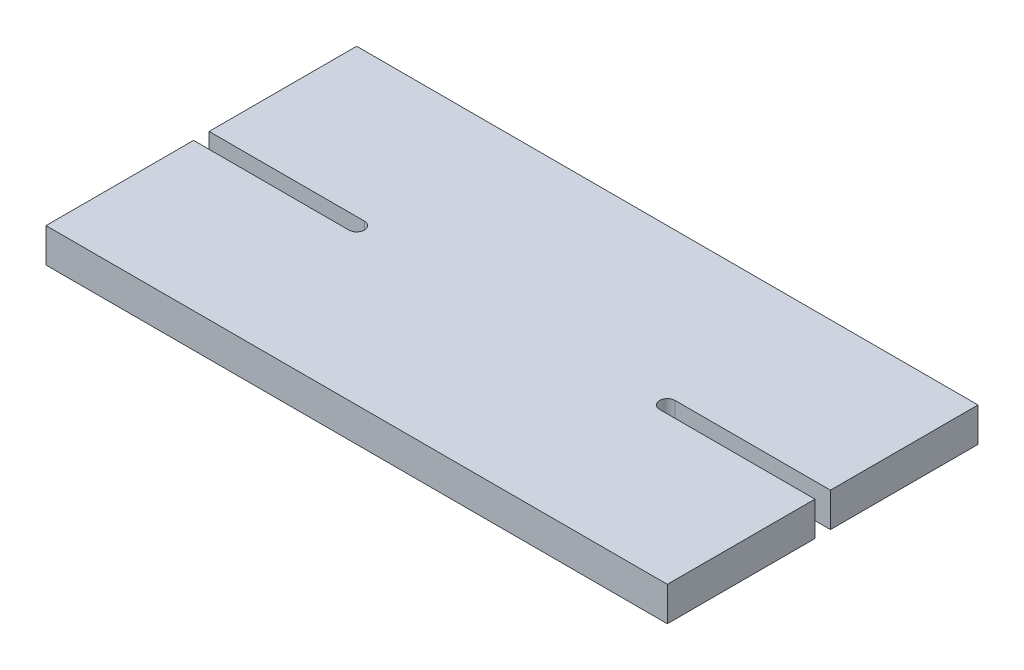
ISO-10303-21;
HEADER;
FILE_DESCRIPTION(('STEP AP214'),'2;1');
FILE_NAME('part.step','',(''),(''),'','','');
FILE_SCHEMA(('AUTOMOTIVE_DESIGN { 1 0 10303 214 1 1 1 1 }'));
ENDSEC;
DATA;
#1=APPLICATION_CONTEXT('core data for automotive mechanical design processes');
#2=APPLICATION_PROTOCOL_DEFINITION('international standard','automotive_design',2000,#1);
#3=PRODUCT_CONTEXT('',#1,'mechanical');
#4=PRODUCT('Part','Part','',(#3));
#5=PRODUCT_RELATED_PRODUCT_CATEGORY('part','',(#4));
#6=PRODUCT_DEFINITION_FORMATION('','',#4);
#7=PRODUCT_DEFINITION_CONTEXT('part definition',#1,'design');
#8=PRODUCT_DEFINITION('design','',#6,#7);
#9=PRODUCT_DEFINITION_SHAPE('','',#8);
#10=(LENGTH_UNIT() NAMED_UNIT(*) SI_UNIT(.MILLI.,.METRE.));
#11=(NAMED_UNIT(*) PLANE_ANGLE_UNIT() SI_UNIT($,.RADIAN.));
#12=(NAMED_UNIT(*) SI_UNIT($,.STERADIAN.) SOLID_ANGLE_UNIT());
#13=UNCERTAINTY_MEASURE_WITH_UNIT(LENGTH_MEASURE(1.E-05),#10,'distance_accuracy_value','');
#14=(GEOMETRIC_REPRESENTATION_CONTEXT(3) GLOBAL_UNCERTAINTY_ASSIGNED_CONTEXT((#13)) GLOBAL_UNIT_ASSIGNED_CONTEXT((#10,
#11,#12)) REPRESENTATION_CONTEXT('',''));
#15=CARTESIAN_POINT('',(0.,0.,0.));
#16=DIRECTION('',(0.,0.,1.));
#17=DIRECTION('',(1.,0.,0.));
#18=AXIS2_PLACEMENT_3D('',#15,#16,#17);
#19=CARTESIAN_POINT('',(200.01,1000.01,-5.));
#20=DIRECTION('',(0.,0.,1.));
#21=DIRECTION('',(-1.,0.,0.));
#22=AXIS2_PLACEMENT_3D('',#19,#20,#21);
#23=PLANE('',#22);
#24=DIRECTION('',(-1.,0.,0.));
#25=VECTOR('',#24,1.);
#26=CARTESIAN_POINT('',(0.,978.,-5.));
#27=LINE('',#26,#25);
#28=CARTESIAN_POINT('',(200.,978.,-5.));
#29=VERTEX_POINT('',#28);
#30=CARTESIAN_POINT('',(100.,978.,-5.00000000000001));
#31=VERTEX_POINT('',#30);
#32=EDGE_CURVE('E188',#29,#31,#27,.T.);
#33=ORIENTED_EDGE('',*,*,#32,.F.);
#34=DIRECTION('',(0.,-1.,0.));
#35=VECTOR('',#34,1.);
#36=CARTESIAN_POINT('',(200.,989.,-5.));
#37=LINE('',#36,#35);
#38=CARTESIAN_POINT('',(200.,1000.,-5.));
#39=VERTEX_POINT('',#38);
#40=EDGE_CURVE('E189',#39,#29,#37,.T.);
#41=ORIENTED_EDGE('',*,*,#40,.F.);
#42=DIRECTION('',(1.,0.,0.));
#43=VECTOR('',#42,1.);
#44=CARTESIAN_POINT('',(0.,1000.,-5.));
#45=LINE('',#44,#43);
#46=CARTESIAN_POINT('',(100.,1000.,-5.00000000000001));
#47=VERTEX_POINT('',#46);
#48=EDGE_CURVE('E207',#47,#39,#45,.T.);
#49=ORIENTED_EDGE('',*,*,#48,.F.);
#50=DIRECTION('',(0.,1.,0.));
#51=VECTOR('',#50,1.);
#52=CARTESIAN_POINT('',(100.,989.,-5.00000000000001));
#53=LINE('',#52,#51);
#54=EDGE_CURVE('E183',#31,#47,#53,.T.);
#55=ORIENTED_EDGE('',*,*,#54,.F.);
#56=EDGE_LOOP('',(#33,#41,#49,#55));
#57=FACE_BOUND('',#56,.T.);
#58=ADVANCED_FACE('F17',(#57),#23,.T.);
#59=CARTESIAN_POINT('',(100.,1000.,0.));
#60=DIRECTION('',(0.,-1.,0.));
#61=DIRECTION('',(0.,0.,-1.));
#62=AXIS2_PLACEMENT_3D('',#59,#60,#61);
#63=CYLINDRICAL_SURFACE('',#62,4.99999999999999);
#64=CARTESIAN_POINT('',(100.,978.,0.));
#65=DIRECTION('',(0.,-1.,0.));
#66=DIRECTION('',(0.,0.,-1.));
#67=AXIS2_PLACEMENT_3D('',#64,#65,#66);
#68=CIRCLE('',#67,4.99999999999999);
#69=CARTESIAN_POINT('',(100.,978.,4.99999999999999));
#70=VERTEX_POINT('',#69);
#71=EDGE_CURVE('E234',#31,#70,#68,.F.);
#72=ORIENTED_EDGE('',*,*,#71,.F.);
#73=ORIENTED_EDGE('',*,*,#54,.T.);
#74=CARTESIAN_POINT('',(100.,1000.,0.));
#75=DIRECTION('',(0.,-1.,0.));
#76=DIRECTION('',(0.,0.,-1.));
#77=AXIS2_PLACEMENT_3D('',#74,#75,#76);
#78=CIRCLE('',#77,4.99999999999999);
#79=CARTESIAN_POINT('',(100.,1000.,5.00000000000001));
#80=VERTEX_POINT('',#79);
#81=EDGE_CURVE('E236',#80,#47,#78,.T.);
#82=ORIENTED_EDGE('',*,*,#81,.F.);
#83=DIRECTION('',(0.,1.,0.));
#84=VECTOR('',#83,1.);
#85=CARTESIAN_POINT('',(100.,989.,4.99999999999999));
#86=LINE('',#85,#84);
#87=EDGE_CURVE('E179',#70,#80,#86,.T.);
#88=ORIENTED_EDGE('',*,*,#87,.F.);
#89=EDGE_LOOP('',(#72,#73,#82,#88));
#90=FACE_BOUND('',#89,.T.);
#91=ADVANCED_FACE('F275',(#90),#63,.F.);
#92=CARTESIAN_POINT('',(99.99,1000.01,4.99999999999999));
#93=DIRECTION('',(0.,0.,-1.));
#94=DIRECTION('',(1.,0.,0.));
#95=AXIS2_PLACEMENT_3D('',#92,#93,#94);
#96=PLANE('',#95);
#97=DIRECTION('',(1.,0.,0.));
#98=VECTOR('',#97,1.);
#99=CARTESIAN_POINT('',(0.,978.,4.99999999999999));
#100=LINE('',#99,#98);
#101=CARTESIAN_POINT('',(200.,978.,4.99999999999999));
#102=VERTEX_POINT('',#101);
#103=EDGE_CURVE('E175',#70,#102,#100,.T.);
#104=ORIENTED_EDGE('',*,*,#103,.F.);
#105=ORIENTED_EDGE('',*,*,#87,.T.);
#106=DIRECTION('',(-1.,0.,0.));
#107=VECTOR('',#106,1.);
#108=CARTESIAN_POINT('',(0.,1000.,5.00000000000002));
#109=LINE('',#108,#107);
#110=CARTESIAN_POINT('',(200.,1000.,5.00000000000001));
#111=VERTEX_POINT('',#110);
#112=EDGE_CURVE('E217',#111,#80,#109,.T.);
#113=ORIENTED_EDGE('',*,*,#112,.F.);
#114=DIRECTION('',(0.,1.,0.));
#115=VECTOR('',#114,1.);
#116=CARTESIAN_POINT('',(200.,989.,5.));
#117=LINE('',#116,#115);
#118=EDGE_CURVE('E170',#102,#111,#117,.T.);
#119=ORIENTED_EDGE('',*,*,#118,.F.);
#120=EDGE_LOOP('',(#104,#105,#113,#119));
#121=FACE_BOUND('',#120,.T.);
#122=ADVANCED_FACE('F279',(#121),#96,.T.);
#123=CARTESIAN_POINT('',(200.,1000.01,4.99));
#124=DIRECTION('',(1.,0.,0.));
#125=DIRECTION('',(0.,0.,1.));
#126=AXIS2_PLACEMENT_3D('',#123,#124,#125);
#127=PLANE('',#126);
#128=DIRECTION('',(0.,0.,1.));
#129=VECTOR('',#128,1.);
#130=CARTESIAN_POINT('',(200.,978.,0.));
#131=LINE('',#130,#129);
#132=CARTESIAN_POINT('',(200.,978.,100.));
#133=VERTEX_POINT('',#132);
#134=EDGE_CURVE('E166',#102,#133,#131,.T.);
#135=ORIENTED_EDGE('',*,*,#134,.F.);
#136=ORIENTED_EDGE('',*,*,#118,.T.);
#137=DIRECTION('',(0.,0.,-1.));
#138=VECTOR('',#137,1.);
#139=CARTESIAN_POINT('',(200.,1000.,0.));
#140=LINE('',#139,#138);
#141=CARTESIAN_POINT('',(200.,1000.,100.));
#142=VERTEX_POINT('',#141);
#143=EDGE_CURVE('E214',#142,#111,#140,.T.);
#144=ORIENTED_EDGE('',*,*,#143,.F.);
#145=DIRECTION('',(0.,1.,0.));
#146=VECTOR('',#145,1.);
#147=CARTESIAN_POINT('',(200.,989.,100.));
#148=LINE('',#147,#146);
#149=EDGE_CURVE('E161',#133,#142,#148,.T.);
#150=ORIENTED_EDGE('',*,*,#149,.F.);
#151=EDGE_LOOP('',(#135,#136,#144,#150));
#152=FACE_BOUND('',#151,.T.);
#153=ADVANCED_FACE('F282',(#152),#127,.T.);
#154=CARTESIAN_POINT('',(200.01,1000.01,100.));
#155=DIRECTION('',(0.,0.,1.));
#156=DIRECTION('',(-1.,0.,0.));
#157=AXIS2_PLACEMENT_3D('',#154,#155,#156);
#158=PLANE('',#157);
#159=DIRECTION('',(-1.,0.,0.));
#160=VECTOR('',#159,1.);
#161=CARTESIAN_POINT('',(0.,978.,100.));
#162=LINE('',#161,#160);
#163=CARTESIAN_POINT('',(-200.,978.,100.));
#164=VERTEX_POINT('',#163);
#165=EDGE_CURVE('E157',#133,#164,#162,.T.);
#166=ORIENTED_EDGE('',*,*,#165,.F.);
#167=ORIENTED_EDGE('',*,*,#149,.T.);
#168=DIRECTION('',(1.,0.,0.));
#169=VECTOR('',#168,1.);
#170=CARTESIAN_POINT('',(0.,1000.,100.));
#171=LINE('',#170,#169);
#172=CARTESIAN_POINT('',(-200.,1000.,100.));
#173=VERTEX_POINT('',#172);
#174=EDGE_CURVE('E218',#173,#142,#171,.T.);
#175=ORIENTED_EDGE('',*,*,#174,.F.);
#176=DIRECTION('',(0.,1.,0.));
#177=VECTOR('',#176,1.);
#178=CARTESIAN_POINT('',(-200.,989.,100.));
#179=LINE('',#178,#177);
#180=EDGE_CURVE('E150',#164,#173,#179,.T.);
#181=ORIENTED_EDGE('',*,*,#180,.F.);
#182=EDGE_LOOP('',(#166,#167,#175,#181));
#183=FACE_BOUND('',#182,.T.);
#184=ADVANCED_FACE('F286',(#183),#158,.T.);
#185=CARTESIAN_POINT('',(-200.,1000.01,100.01));
#186=DIRECTION('',(-1.,0.,0.));
#187=DIRECTION('',(0.,0.,-1.));
#188=AXIS2_PLACEMENT_3D('',#185,#186,#187);
#189=PLANE('',#188);
#190=DIRECTION('',(0.,0.,-1.));
#191=VECTOR('',#190,1.);
#192=CARTESIAN_POINT('',(-200.,978.,0.));
#193=LINE('',#192,#191);
#194=CARTESIAN_POINT('',(-200.,978.,5.00000000000001));
#195=VERTEX_POINT('',#194);
#196=EDGE_CURVE('E153',#164,#195,#193,.T.);
#197=ORIENTED_EDGE('',*,*,#196,.F.);
#198=ORIENTED_EDGE('',*,*,#180,.T.);
#199=DIRECTION('',(0.,0.,1.));
#200=VECTOR('',#199,1.);
#201=CARTESIAN_POINT('',(-200.,1000.,0.));
#202=LINE('',#201,#200);
#203=CARTESIAN_POINT('',(-200.,1000.,5.00000000000001));
#204=VERTEX_POINT('',#203);
#205=EDGE_CURVE('E126',#204,#173,#202,.T.);
#206=ORIENTED_EDGE('',*,*,#205,.F.);
#207=DIRECTION('',(0.,1.,0.));
#208=VECTOR('',#207,1.);
#209=CARTESIAN_POINT('',(-200.,989.,4.99999999999999));
#210=LINE('',#209,#208);
#211=EDGE_CURVE('E118',#195,#204,#210,.T.);
#212=ORIENTED_EDGE('',*,*,#211,.F.);
#213=EDGE_LOOP('',(#197,#198,#206,#212));
#214=FACE_BOUND('',#213,.T.);
#215=ADVANCED_FACE('F289',(#214),#189,.T.);
#216=CARTESIAN_POINT('',(-200.01,1000.01,4.99999999999999));
#217=DIRECTION('',(0.,0.,-1.));
#218=DIRECTION('',(1.,0.,0.));
#219=AXIS2_PLACEMENT_3D('',#216,#217,#218);
#220=PLANE('',#219);
#221=DIRECTION('',(1.,0.,0.));
#222=VECTOR('',#221,1.);
#223=CARTESIAN_POINT('',(0.,978.,5.00000000000002));
#224=LINE('',#223,#222);
#225=CARTESIAN_POINT('',(-100.,978.,5.00000000000002));
#226=VERTEX_POINT('',#225);
#227=EDGE_CURVE('E156',#195,#226,#224,.T.);
#228=ORIENTED_EDGE('',*,*,#227,.F.);
#229=ORIENTED_EDGE('',*,*,#211,.T.);
#230=DIRECTION('',(-1.,0.,0.));
#231=VECTOR('',#230,1.);
#232=CARTESIAN_POINT('',(0.,1000.,5.00000000000002));
#233=LINE('',#232,#231);
#234=CARTESIAN_POINT('',(-100.,1000.,5.00000000000002));
#235=VERTEX_POINT('',#234);
#236=EDGE_CURVE('E121',#235,#204,#233,.T.);
#237=ORIENTED_EDGE('',*,*,#236,.F.);
#238=DIRECTION('',(0.,1.,0.));
#239=VECTOR('',#238,1.);
#240=CARTESIAN_POINT('',(-100.,989.,5.00000000000001));
#241=LINE('',#240,#239);
#242=EDGE_CURVE('E108',#226,#235,#241,.T.);
#243=ORIENTED_EDGE('',*,*,#242,.F.);
#244=EDGE_LOOP('',(#228,#229,#237,#243));
#245=FACE_BOUND('',#244,.T.);
#246=ADVANCED_FACE('F122',(#245),#220,.T.);
#247=CARTESIAN_POINT('',(-100.,1000.,0.));
#248=DIRECTION('',(0.,-1.,0.));
#249=DIRECTION('',(0.,0.,-1.));
#250=AXIS2_PLACEMENT_3D('',#247,#248,#249);
#251=CYLINDRICAL_SURFACE('',#250,5.);
#252=CARTESIAN_POINT('',(-100.,978.,0.));
#253=DIRECTION('',(0.,-1.,0.));
#254=DIRECTION('',(0.,0.,-1.));
#255=AXIS2_PLACEMENT_3D('',#252,#253,#254);
#256=CIRCLE('',#255,5.);
#257=CARTESIAN_POINT('',(-100.,978.,-5.));
#258=VERTEX_POINT('',#257);
#259=EDGE_CURVE('E114',#226,#258,#256,.F.);
#260=ORIENTED_EDGE('',*,*,#259,.F.);
#261=ORIENTED_EDGE('',*,*,#242,.T.);
#262=CARTESIAN_POINT('',(-100.,1000.,0.));
#263=DIRECTION('',(0.,-1.,0.));
#264=DIRECTION('',(0.,0.,-1.));
#265=AXIS2_PLACEMENT_3D('',#262,#263,#264);
#266=CIRCLE('',#265,5.);
#267=CARTESIAN_POINT('',(-100.,1000.,-5.));
#268=VERTEX_POINT('',#267);
#269=EDGE_CURVE('E21',#268,#235,#266,.T.);
#270=ORIENTED_EDGE('',*,*,#269,.F.);
#271=DIRECTION('',(0.,1.,0.));
#272=VECTOR('',#271,1.);
#273=CARTESIAN_POINT('',(-100.,989.,-5.));
#274=LINE('',#273,#272);
#275=EDGE_CURVE('E103',#258,#268,#274,.T.);
#276=ORIENTED_EDGE('',*,*,#275,.F.);
#277=EDGE_LOOP('',(#260,#261,#270,#276));
#278=FACE_BOUND('',#277,.T.);
#279=ADVANCED_FACE('F110',(#278),#251,.F.);
#280=CARTESIAN_POINT('',(-99.99,1000.01,-5.));
#281=DIRECTION('',(0.,0.,1.));
#282=DIRECTION('',(-1.,0.,0.));
#283=AXIS2_PLACEMENT_3D('',#280,#281,#282);
#284=PLANE('',#283);
#285=DIRECTION('',(-1.,0.,0.));
#286=VECTOR('',#285,1.);
#287=CARTESIAN_POINT('',(0.,978.,-5.));
#288=LINE('',#287,#286);
#289=CARTESIAN_POINT('',(-200.,978.,-5.));
#290=VERTEX_POINT('',#289);
#291=EDGE_CURVE('E230',#258,#290,#288,.T.);
#292=ORIENTED_EDGE('',*,*,#291,.F.);
#293=ORIENTED_EDGE('',*,*,#275,.T.);
#294=DIRECTION('',(1.,0.,0.));
#295=VECTOR('',#294,1.);
#296=CARTESIAN_POINT('',(0.,1000.,-5.));
#297=LINE('',#296,#295);
#298=CARTESIAN_POINT('',(-200.,1000.,-5.));
#299=VERTEX_POINT('',#298);
#300=EDGE_CURVE('E131',#299,#268,#297,.T.);
#301=ORIENTED_EDGE('',*,*,#300,.F.);
#302=DIRECTION('',(0.,1.,0.));
#303=VECTOR('',#302,1.);
#304=CARTESIAN_POINT('',(-200.,989.,-5.));
#305=LINE('',#304,#303);
#306=EDGE_CURVE('E139',#290,#299,#305,.T.);
#307=ORIENTED_EDGE('',*,*,#306,.F.);
#308=EDGE_LOOP('',(#292,#293,#301,#307));
#309=FACE_BOUND('',#308,.T.);
#310=ADVANCED_FACE('F262',(#309),#284,.T.);
#311=CARTESIAN_POINT('',(-200.01,1000.,100.01));
#312=DIRECTION('',(0.,1.,0.));
#313=DIRECTION('',(1.,0.,0.));
#314=AXIS2_PLACEMENT_3D('',#311,#312,#313);
#315=PLANE('',#314);
#316=ORIENTED_EDGE('',*,*,#81,.T.);
#317=ORIENTED_EDGE('',*,*,#48,.T.);
#318=DIRECTION('',(0.,0.,1.));
#319=VECTOR('',#318,1.);
#320=CARTESIAN_POINT('',(200.,1000.,-52.5));
#321=LINE('',#320,#319);
#322=CARTESIAN_POINT('',(200.,1000.,-100.));
#323=VERTEX_POINT('',#322);
#324=EDGE_CURVE('E193',#323,#39,#321,.T.);
#325=ORIENTED_EDGE('',*,*,#324,.F.);
#326=DIRECTION('',(1.,0.,0.));
#327=VECTOR('',#326,1.);
#328=CARTESIAN_POINT('',(0.,1000.,-100.));
#329=LINE('',#328,#327);
#330=CARTESIAN_POINT('',(-200.,1000.,-100.));
#331=VERTEX_POINT('',#330);
#332=EDGE_CURVE('E142',#331,#323,#329,.T.);
#333=ORIENTED_EDGE('',*,*,#332,.F.);
#334=DIRECTION('',(0.,0.,-1.));
#335=VECTOR('',#334,1.);
#336=CARTESIAN_POINT('',(-200.,1000.,-52.5));
#337=LINE('',#336,#335);
#338=EDGE_CURVE('E146',#299,#331,#337,.T.);
#339=ORIENTED_EDGE('',*,*,#338,.F.);
#340=ORIENTED_EDGE('',*,*,#300,.T.);
#341=ORIENTED_EDGE('',*,*,#269,.T.);
#342=ORIENTED_EDGE('',*,*,#236,.T.);
#343=ORIENTED_EDGE('',*,*,#205,.T.);
#344=ORIENTED_EDGE('',*,*,#174,.T.);
#345=ORIENTED_EDGE('',*,*,#143,.T.);
#346=ORIENTED_EDGE('',*,*,#112,.T.);
#347=EDGE_LOOP('',(#316,#317,#325,#333,#339,#340,#341,#342,#343,#344,#345,#346));
#348=FACE_BOUND('',#347,.T.);
#349=ADVANCED_FACE('F129',(#348),#315,.T.);
#350=CARTESIAN_POINT('',(200.,1000.01,-100.01));
#351=DIRECTION('',(1.,0.,0.));
#352=DIRECTION('',(0.,0.,1.));
#353=AXIS2_PLACEMENT_3D('',#350,#351,#352);
#354=PLANE('',#353);
#355=DIRECTION('',(0.,0.,1.));
#356=VECTOR('',#355,1.);
#357=CARTESIAN_POINT('',(200.,978.,0.));
#358=LINE('',#357,#356);
#359=CARTESIAN_POINT('',(200.,978.,-100.));
#360=VERTEX_POINT('',#359);
#361=EDGE_CURVE('E185',#360,#29,#358,.T.);
#362=ORIENTED_EDGE('',*,*,#361,.F.);
#363=DIRECTION('',(0.,-1.,0.));
#364=VECTOR('',#363,1.);
#365=CARTESIAN_POINT('',(200.,989.,-100.));
#366=LINE('',#365,#364);
#367=EDGE_CURVE('E198',#323,#360,#366,.T.);
#368=ORIENTED_EDGE('',*,*,#367,.F.);
#369=ORIENTED_EDGE('',*,*,#324,.T.);
#370=ORIENTED_EDGE('',*,*,#40,.T.);
#371=EDGE_LOOP('',(#362,#368,#369,#370));
#372=FACE_BOUND('',#371,.T.);
#373=ADVANCED_FACE('F269',(#372),#354,.T.);
#374=CARTESIAN_POINT('',(200.01,978.,100.01));
#375=DIRECTION('',(0.,-1.,0.));
#376=DIRECTION('',(-1.,0.,0.));
#377=AXIS2_PLACEMENT_3D('',#374,#375,#376);
#378=PLANE('',#377);
#379=DIRECTION('',(0.,0.,1.));
#380=VECTOR('',#379,1.);
#381=CARTESIAN_POINT('',(-200.,978.,-52.5));
#382=LINE('',#381,#380);
#383=CARTESIAN_POINT('',(-200.,978.,-100.));
#384=VERTEX_POINT('',#383);
#385=EDGE_CURVE('E36',#384,#290,#382,.T.);
#386=ORIENTED_EDGE('',*,*,#385,.F.);
#387=DIRECTION('',(-1.,0.,0.));
#388=VECTOR('',#387,1.);
#389=CARTESIAN_POINT('',(0.,978.,-100.));
#390=LINE('',#389,#388);
#391=EDGE_CURVE('E27',#360,#384,#390,.T.);
#392=ORIENTED_EDGE('',*,*,#391,.F.);
#393=ORIENTED_EDGE('',*,*,#361,.T.);
#394=ORIENTED_EDGE('',*,*,#32,.T.);
#395=ORIENTED_EDGE('',*,*,#71,.T.);
#396=ORIENTED_EDGE('',*,*,#103,.T.);
#397=ORIENTED_EDGE('',*,*,#134,.T.);
#398=ORIENTED_EDGE('',*,*,#165,.T.);
#399=ORIENTED_EDGE('',*,*,#196,.T.);
#400=ORIENTED_EDGE('',*,*,#227,.T.);
#401=ORIENTED_EDGE('',*,*,#259,.T.);
#402=ORIENTED_EDGE('',*,*,#291,.T.);
#403=EDGE_LOOP('',(#386,#392,#393,#394,#395,#396,#397,#398,#399,#400,#401,#402));
#404=FACE_BOUND('',#403,.T.);
#405=ADVANCED_FACE('F261',(#404),#378,.T.);
#406=CARTESIAN_POINT('',(-200.,1000.01,-4.99));
#407=DIRECTION('',(-1.,0.,0.));
#408=DIRECTION('',(0.,0.,-1.));
#409=AXIS2_PLACEMENT_3D('',#406,#407,#408);
#410=PLANE('',#409);
#411=ORIENTED_EDGE('',*,*,#385,.T.);
#412=ORIENTED_EDGE('',*,*,#306,.T.);
#413=ORIENTED_EDGE('',*,*,#338,.T.);
#414=DIRECTION('',(0.,1.,0.));
#415=VECTOR('',#414,1.);
#416=CARTESIAN_POINT('',(-200.,989.,-100.));
#417=LINE('',#416,#415);
#418=EDGE_CURVE('E11',#384,#331,#417,.T.);
#419=ORIENTED_EDGE('',*,*,#418,.F.);
#420=EDGE_LOOP('',(#411,#412,#413,#419));
#421=FACE_BOUND('',#420,.T.);
#422=ADVANCED_FACE('F264',(#421),#410,.T.);
#423=CARTESIAN_POINT('',(-200.01,1000.01,-100.));
#424=DIRECTION('',(0.,0.,-1.));
#425=DIRECTION('',(1.,0.,0.));
#426=AXIS2_PLACEMENT_3D('',#423,#424,#425);
#427=PLANE('',#426);
#428=ORIENTED_EDGE('',*,*,#391,.T.);
#429=ORIENTED_EDGE('',*,*,#418,.T.);
#430=ORIENTED_EDGE('',*,*,#332,.T.);
#431=ORIENTED_EDGE('',*,*,#367,.T.);
#432=EDGE_LOOP('',(#428,#429,#430,#431));
#433=FACE_BOUND('',#432,.T.);
#434=ADVANCED_FACE('F19',(#433),#427,.T.);
#435=CLOSED_SHELL('',(#58,#91,#122,#153,#184,#215,#246,#279,#310,#349,#373,#405,#422,#434));
#436=MANIFOLD_SOLID_BREP('B1',#435);
#437=ADVANCED_BREP_SHAPE_REPRESENTATION('',(#18,#436),#14);
#438=SHAPE_DEFINITION_REPRESENTATION(#9,#437);
ENDSEC;
END-ISO-10303-21;
